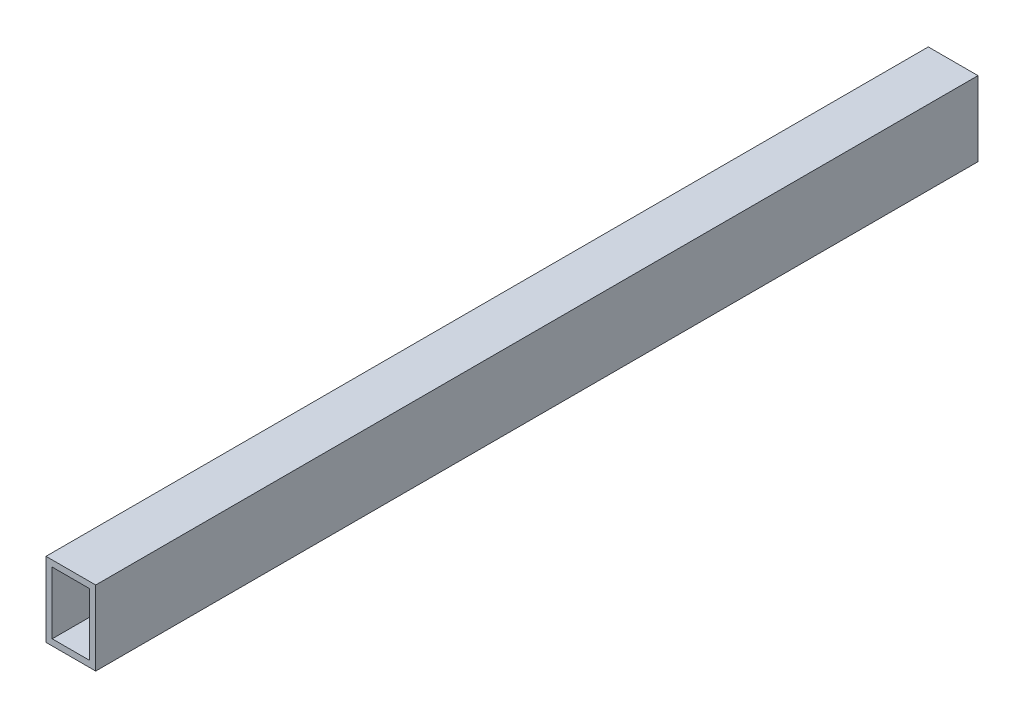
ISO-10303-21;
HEADER;
FILE_DESCRIPTION(('STEP AP214'),'2;1');
FILE_NAME('part.step','',(''),(''),'','','');
FILE_SCHEMA(('AUTOMOTIVE_DESIGN { 1 0 10303 214 1 1 1 1 }'));
ENDSEC;
DATA;
#1=APPLICATION_CONTEXT('core data for automotive mechanical design processes');
#2=APPLICATION_PROTOCOL_DEFINITION('international standard','automotive_design',2000,#1);
#3=PRODUCT_CONTEXT('',#1,'mechanical');
#4=PRODUCT('Part','Part','',(#3));
#5=PRODUCT_RELATED_PRODUCT_CATEGORY('part','',(#4));
#6=PRODUCT_DEFINITION_FORMATION('','',#4);
#7=PRODUCT_DEFINITION_CONTEXT('part definition',#1,'design');
#8=PRODUCT_DEFINITION('design','',#6,#7);
#9=PRODUCT_DEFINITION_SHAPE('','',#8);
#10=(LENGTH_UNIT() NAMED_UNIT(*) SI_UNIT(.MILLI.,.METRE.));
#11=(NAMED_UNIT(*) PLANE_ANGLE_UNIT() SI_UNIT($,.RADIAN.));
#12=(NAMED_UNIT(*) SI_UNIT($,.STERADIAN.) SOLID_ANGLE_UNIT());
#13=UNCERTAINTY_MEASURE_WITH_UNIT(LENGTH_MEASURE(1.E-05),#10,'distance_accuracy_value','');
#14=(GEOMETRIC_REPRESENTATION_CONTEXT(3) GLOBAL_UNCERTAINTY_ASSIGNED_CONTEXT((#13)) GLOBAL_UNIT_ASSIGNED_CONTEXT((#10,
#11,#12)) REPRESENTATION_CONTEXT('',''));
#15=CARTESIAN_POINT('',(0.,0.,0.));
#16=DIRECTION('',(0.,0.,1.));
#17=DIRECTION('',(1.,0.,0.));
#18=AXIS2_PLACEMENT_3D('',#15,#16,#17);
#19=CARTESIAN_POINT('',(0.,0.,901.7));
#20=DIRECTION('',(0.,0.,-1.));
#21=DIRECTION('',(-1.,0.,0.));
#22=AXIS2_PLACEMENT_3D('',#19,#20,#21);
#23=PLANE('',#22);
#24=DIRECTION('',(0.,1.,0.));
#25=VECTOR('',#24,1.);
#26=CARTESIAN_POINT('',(25.4,-38.1,901.7));
#27=LINE('',#26,#25);
#28=CARTESIAN_POINT('',(25.4,-38.1,901.7));
#29=VERTEX_POINT('',#28);
#30=CARTESIAN_POINT('',(25.4,38.1,901.7));
#31=VERTEX_POINT('',#30);
#32=EDGE_CURVE('E164',#29,#31,#27,.T.);
#33=ORIENTED_EDGE('',*,*,#32,.T.);
#34=DIRECTION('',(-1.,0.,0.));
#35=VECTOR('',#34,1.);
#36=CARTESIAN_POINT('',(-25.4,38.1,901.7));
#37=LINE('',#36,#35);
#38=CARTESIAN_POINT('',(-25.4,38.1,901.7));
#39=VERTEX_POINT('',#38);
#40=EDGE_CURVE('E169',#31,#39,#37,.T.);
#41=ORIENTED_EDGE('',*,*,#40,.T.);
#42=DIRECTION('',(0.,-1.,0.));
#43=VECTOR('',#42,1.);
#44=CARTESIAN_POINT('',(-25.4,-38.1,901.7));
#45=LINE('',#44,#43);
#46=CARTESIAN_POINT('',(-25.4,-38.1,901.7));
#47=VERTEX_POINT('',#46);
#48=EDGE_CURVE('E174',#39,#47,#45,.T.);
#49=ORIENTED_EDGE('',*,*,#48,.T.);
#50=DIRECTION('',(1.,0.,0.));
#51=VECTOR('',#50,1.);
#52=CARTESIAN_POINT('',(-25.4,-38.1,901.7));
#53=LINE('',#52,#51);
#54=EDGE_CURVE('E177',#47,#29,#53,.T.);
#55=ORIENTED_EDGE('',*,*,#54,.T.);
#56=EDGE_LOOP('',(#33,#41,#49,#55));
#57=FACE_BOUND('',#56,.T.);
#58=DIRECTION('',(0.,1.,0.));
#59=VECTOR('',#58,1.);
#60=CARTESIAN_POINT('',(19.05,-31.75,901.7));
#61=LINE('',#60,#59);
#62=CARTESIAN_POINT('',(19.05,-31.75,901.7));
#63=VERTEX_POINT('',#62);
#64=CARTESIAN_POINT('',(19.05,31.75,901.7));
#65=VERTEX_POINT('',#64);
#66=EDGE_CURVE('E117',#63,#65,#61,.T.);
#67=ORIENTED_EDGE('',*,*,#66,.F.);
#68=DIRECTION('',(1.,0.,0.));
#69=VECTOR('',#68,1.);
#70=CARTESIAN_POINT('',(-19.05,-31.75,901.7));
#71=LINE('',#70,#69);
#72=CARTESIAN_POINT('',(-19.05,-31.75,901.7));
#73=VERTEX_POINT('',#72);
#74=EDGE_CURVE('E142',#73,#63,#71,.T.);
#75=ORIENTED_EDGE('',*,*,#74,.F.);
#76=DIRECTION('',(0.,-1.,0.));
#77=VECTOR('',#76,1.);
#78=CARTESIAN_POINT('',(-19.05,-31.75,901.7));
#79=LINE('',#78,#77);
#80=CARTESIAN_POINT('',(-19.05,31.75,901.7));
#81=VERTEX_POINT('',#80);
#82=EDGE_CURVE('E139',#81,#73,#79,.T.);
#83=ORIENTED_EDGE('',*,*,#82,.F.);
#84=DIRECTION('',(-1.,0.,0.));
#85=VECTOR('',#84,1.);
#86=CARTESIAN_POINT('',(-19.05,31.75,901.7));
#87=LINE('',#86,#85);
#88=EDGE_CURVE('E123',#65,#81,#87,.T.);
#89=ORIENTED_EDGE('',*,*,#88,.F.);
#90=EDGE_LOOP('',(#67,#75,#83,#89));
#91=FACE_BOUND('',#90,.T.);
#92=ADVANCED_FACE('F49',(#57,#91),#23,.F.);
#93=CARTESIAN_POINT('',(0.,0.,0.));
#94=DIRECTION('',(0.,0.,-1.));
#95=DIRECTION('',(-1.,0.,0.));
#96=AXIS2_PLACEMENT_3D('',#93,#94,#95);
#97=PLANE('',#96);
#98=DIRECTION('',(0.,1.,0.));
#99=VECTOR('',#98,1.);
#100=CARTESIAN_POINT('',(25.4,-38.1,0.));
#101=LINE('',#100,#99);
#102=CARTESIAN_POINT('',(25.4,-38.1,0.));
#103=VERTEX_POINT('',#102);
#104=CARTESIAN_POINT('',(25.4,38.1,0.));
#105=VERTEX_POINT('',#104);
#106=EDGE_CURVE('E131',#103,#105,#101,.T.);
#107=ORIENTED_EDGE('',*,*,#106,.F.);
#108=DIRECTION('',(1.,0.,0.));
#109=VECTOR('',#108,1.);
#110=CARTESIAN_POINT('',(-25.4,-38.1,0.));
#111=LINE('',#110,#109);
#112=CARTESIAN_POINT('',(-25.4,-38.1,0.));
#113=VERTEX_POINT('',#112);
#114=EDGE_CURVE('E166',#113,#103,#111,.T.);
#115=ORIENTED_EDGE('',*,*,#114,.F.);
#116=DIRECTION('',(0.,-1.,0.));
#117=VECTOR('',#116,1.);
#118=CARTESIAN_POINT('',(-25.4,-38.1,0.));
#119=LINE('',#118,#117);
#120=CARTESIAN_POINT('',(-25.4,38.1,0.));
#121=VERTEX_POINT('',#120);
#122=EDGE_CURVE('E187',#121,#113,#119,.T.);
#123=ORIENTED_EDGE('',*,*,#122,.F.);
#124=DIRECTION('',(-1.,0.,0.));
#125=VECTOR('',#124,1.);
#126=CARTESIAN_POINT('',(-25.4,38.1,0.));
#127=LINE('',#126,#125);
#128=EDGE_CURVE('E181',#105,#121,#127,.T.);
#129=ORIENTED_EDGE('',*,*,#128,.F.);
#130=EDGE_LOOP('',(#107,#115,#123,#129));
#131=FACE_BOUND('',#130,.T.);
#132=DIRECTION('',(1.,0.,0.));
#133=VECTOR('',#132,1.);
#134=CARTESIAN_POINT('',(-19.05,-31.75,0.));
#135=LINE('',#134,#133);
#136=CARTESIAN_POINT('',(-19.05,-31.75,0.));
#137=VERTEX_POINT('',#136);
#138=CARTESIAN_POINT('',(19.05,-31.75,0.));
#139=VERTEX_POINT('',#138);
#140=EDGE_CURVE('E127',#137,#139,#135,.T.);
#141=ORIENTED_EDGE('',*,*,#140,.T.);
#142=DIRECTION('',(0.,1.,0.));
#143=VECTOR('',#142,1.);
#144=CARTESIAN_POINT('',(19.05,-31.75,0.));
#145=LINE('',#144,#143);
#146=CARTESIAN_POINT('',(19.05,31.75,0.));
#147=VERTEX_POINT('',#146);
#148=EDGE_CURVE('E74',#139,#147,#145,.T.);
#149=ORIENTED_EDGE('',*,*,#148,.T.);
#150=DIRECTION('',(-1.,0.,0.));
#151=VECTOR('',#150,1.);
#152=CARTESIAN_POINT('',(-19.05,31.75,0.));
#153=LINE('',#152,#151);
#154=CARTESIAN_POINT('',(-19.05,31.75,0.));
#155=VERTEX_POINT('',#154);
#156=EDGE_CURVE('E135',#147,#155,#153,.T.);
#157=ORIENTED_EDGE('',*,*,#156,.T.);
#158=DIRECTION('',(0.,-1.,0.));
#159=VECTOR('',#158,1.);
#160=CARTESIAN_POINT('',(-19.05,-31.75,0.));
#161=LINE('',#160,#159);
#162=EDGE_CURVE('E155',#155,#137,#161,.T.);
#163=ORIENTED_EDGE('',*,*,#162,.T.);
#164=EDGE_LOOP('',(#141,#149,#157,#163));
#165=FACE_BOUND('',#164,.T.);
#166=ADVANCED_FACE('F207',(#131,#165),#97,.T.);
#167=CARTESIAN_POINT('',(25.4,-38.1,901.7));
#168=DIRECTION('',(-1.,0.,0.));
#169=DIRECTION('',(0.,0.,1.));
#170=AXIS2_PLACEMENT_3D('',#167,#168,#169);
#171=PLANE('',#170);
#172=ORIENTED_EDGE('',*,*,#106,.T.);
#173=DIRECTION('',(0.,0.,-1.));
#174=VECTOR('',#173,1.);
#175=CARTESIAN_POINT('',(25.4,38.1,901.7));
#176=LINE('',#175,#174);
#177=EDGE_CURVE('E12',#31,#105,#176,.T.);
#178=ORIENTED_EDGE('',*,*,#177,.F.);
#179=ORIENTED_EDGE('',*,*,#32,.F.);
#180=DIRECTION('',(0.,0.,-1.));
#181=VECTOR('',#180,1.);
#182=CARTESIAN_POINT('',(25.4,-38.1,901.7));
#183=LINE('',#182,#181);
#184=EDGE_CURVE('E176',#29,#103,#183,.T.);
#185=ORIENTED_EDGE('',*,*,#184,.T.);
#186=EDGE_LOOP('',(#172,#178,#179,#185));
#187=FACE_BOUND('',#186,.T.);
#188=ADVANCED_FACE('F55',(#187),#171,.F.);
#189=CARTESIAN_POINT('',(-25.4,38.1,901.7));
#190=DIRECTION('',(0.,-1.,0.));
#191=DIRECTION('',(0.,0.,-1.));
#192=AXIS2_PLACEMENT_3D('',#189,#190,#191);
#193=PLANE('',#192);
#194=ORIENTED_EDGE('',*,*,#128,.T.);
#195=DIRECTION('',(0.,0.,-1.));
#196=VECTOR('',#195,1.);
#197=CARTESIAN_POINT('',(-25.4,38.1,901.7));
#198=LINE('',#197,#196);
#199=EDGE_CURVE('E56',#39,#121,#198,.T.);
#200=ORIENTED_EDGE('',*,*,#199,.F.);
#201=ORIENTED_EDGE('',*,*,#40,.F.);
#202=ORIENTED_EDGE('',*,*,#177,.T.);
#203=EDGE_LOOP('',(#194,#200,#201,#202));
#204=FACE_BOUND('',#203,.T.);
#205=ADVANCED_FACE('F218',(#204),#193,.F.);
#206=CARTESIAN_POINT('',(-25.4,-38.1,901.7));
#207=DIRECTION('',(1.,0.,0.));
#208=DIRECTION('',(0.,0.,-1.));
#209=AXIS2_PLACEMENT_3D('',#206,#207,#208);
#210=PLANE('',#209);
#211=ORIENTED_EDGE('',*,*,#122,.T.);
#212=DIRECTION('',(0.,0.,-1.));
#213=VECTOR('',#212,1.);
#214=CARTESIAN_POINT('',(-25.4,-38.1,901.7));
#215=LINE('',#214,#213);
#216=EDGE_CURVE('E191',#47,#113,#215,.T.);
#217=ORIENTED_EDGE('',*,*,#216,.F.);
#218=ORIENTED_EDGE('',*,*,#48,.F.);
#219=ORIENTED_EDGE('',*,*,#199,.T.);
#220=EDGE_LOOP('',(#211,#217,#218,#219));
#221=FACE_BOUND('',#220,.T.);
#222=ADVANCED_FACE('F201',(#221),#210,.F.);
#223=CARTESIAN_POINT('',(-25.4,-38.1,901.7));
#224=DIRECTION('',(0.,1.,0.));
#225=DIRECTION('',(0.,0.,1.));
#226=AXIS2_PLACEMENT_3D('',#223,#224,#225);
#227=PLANE('',#226);
#228=ORIENTED_EDGE('',*,*,#114,.T.);
#229=ORIENTED_EDGE('',*,*,#184,.F.);
#230=ORIENTED_EDGE('',*,*,#54,.F.);
#231=ORIENTED_EDGE('',*,*,#216,.T.);
#232=EDGE_LOOP('',(#228,#229,#230,#231));
#233=FACE_BOUND('',#232,.T.);
#234=ADVANCED_FACE('F213',(#233),#227,.F.);
#235=CARTESIAN_POINT('',(19.05,-31.75,901.7));
#236=DIRECTION('',(-1.,0.,0.));
#237=DIRECTION('',(0.,0.,1.));
#238=AXIS2_PLACEMENT_3D('',#235,#236,#237);
#239=PLANE('',#238);
#240=ORIENTED_EDGE('',*,*,#148,.F.);
#241=DIRECTION('',(0.,0.,-1.));
#242=VECTOR('',#241,1.);
#243=CARTESIAN_POINT('',(19.05,-31.75,901.7));
#244=LINE('',#243,#242);
#245=EDGE_CURVE('E118',#63,#139,#244,.T.);
#246=ORIENTED_EDGE('',*,*,#245,.F.);
#247=ORIENTED_EDGE('',*,*,#66,.T.);
#248=DIRECTION('',(0.,0.,-1.));
#249=VECTOR('',#248,1.);
#250=CARTESIAN_POINT('',(19.05,31.75,901.7));
#251=LINE('',#250,#249);
#252=EDGE_CURVE('E116',#65,#147,#251,.T.);
#253=ORIENTED_EDGE('',*,*,#252,.T.);
#254=EDGE_LOOP('',(#240,#246,#247,#253));
#255=FACE_BOUND('',#254,.T.);
#256=ADVANCED_FACE('F119',(#255),#239,.T.);
#257=CARTESIAN_POINT('',(-19.05,31.75,901.7));
#258=DIRECTION('',(0.,-1.,0.));
#259=DIRECTION('',(0.,0.,-1.));
#260=AXIS2_PLACEMENT_3D('',#257,#258,#259);
#261=PLANE('',#260);
#262=ORIENTED_EDGE('',*,*,#156,.F.);
#263=ORIENTED_EDGE('',*,*,#252,.F.);
#264=ORIENTED_EDGE('',*,*,#88,.T.);
#265=DIRECTION('',(0.,0.,-1.));
#266=VECTOR('',#265,1.);
#267=CARTESIAN_POINT('',(-19.05,31.75,901.7));
#268=LINE('',#267,#266);
#269=EDGE_CURVE('E133',#81,#155,#268,.T.);
#270=ORIENTED_EDGE('',*,*,#269,.T.);
#271=EDGE_LOOP('',(#262,#263,#264,#270));
#272=FACE_BOUND('',#271,.T.);
#273=ADVANCED_FACE('F129',(#272),#261,.T.);
#274=CARTESIAN_POINT('',(-19.05,-31.75,901.7));
#275=DIRECTION('',(1.,0.,0.));
#276=DIRECTION('',(0.,0.,-1.));
#277=AXIS2_PLACEMENT_3D('',#274,#275,#276);
#278=PLANE('',#277);
#279=ORIENTED_EDGE('',*,*,#162,.F.);
#280=ORIENTED_EDGE('',*,*,#269,.F.);
#281=ORIENTED_EDGE('',*,*,#82,.T.);
#282=DIRECTION('',(0.,0.,-1.));
#283=VECTOR('',#282,1.);
#284=CARTESIAN_POINT('',(-19.05,-31.75,901.7));
#285=LINE('',#284,#283);
#286=EDGE_CURVE('E67',#73,#137,#285,.T.);
#287=ORIENTED_EDGE('',*,*,#286,.T.);
#288=EDGE_LOOP('',(#279,#280,#281,#287));
#289=FACE_BOUND('',#288,.T.);
#290=ADVANCED_FACE('F242',(#289),#278,.T.);
#291=CARTESIAN_POINT('',(-19.05,-31.75,901.7));
#292=DIRECTION('',(0.,1.,0.));
#293=DIRECTION('',(0.,0.,1.));
#294=AXIS2_PLACEMENT_3D('',#291,#292,#293);
#295=PLANE('',#294);
#296=ORIENTED_EDGE('',*,*,#140,.F.);
#297=ORIENTED_EDGE('',*,*,#286,.F.);
#298=ORIENTED_EDGE('',*,*,#74,.T.);
#299=ORIENTED_EDGE('',*,*,#245,.T.);
#300=EDGE_LOOP('',(#296,#297,#298,#299));
#301=FACE_BOUND('',#300,.T.);
#302=ADVANCED_FACE('F243',(#301),#295,.T.);
#303=CLOSED_SHELL('',(#92,#166,#188,#205,#222,#234,#256,#273,#290,#302));
#304=MANIFOLD_SOLID_BREP('B2',#303);
#305=ADVANCED_BREP_SHAPE_REPRESENTATION('',(#18,#304),#14);
#306=SHAPE_DEFINITION_REPRESENTATION(#9,#305);
ENDSEC;
END-ISO-10303-21;
